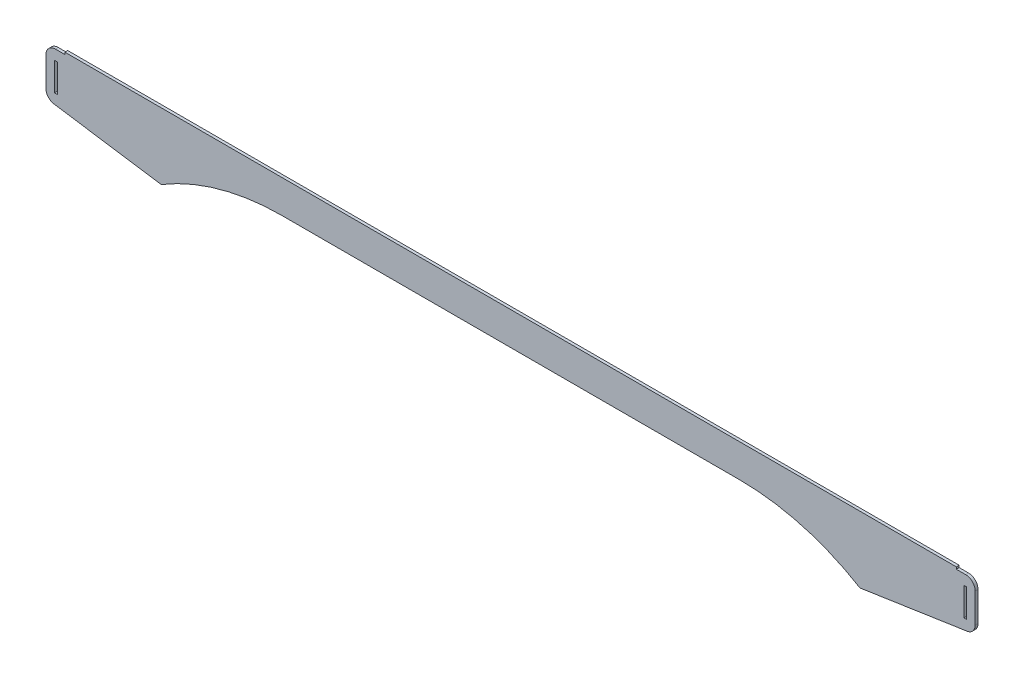
ISO-10303-21;
HEADER;
FILE_DESCRIPTION(('STEP AP214'),'2;1');
FILE_NAME('part.step','',(''),(''),'','','');
FILE_SCHEMA(('AUTOMOTIVE_DESIGN { 1 0 10303 214 1 1 1 1 }'));
ENDSEC;
DATA;
#1=APPLICATION_CONTEXT('core data for automotive mechanical design processes');
#2=APPLICATION_PROTOCOL_DEFINITION('international standard','automotive_design',2000,#1);
#3=PRODUCT_CONTEXT('',#1,'mechanical');
#4=PRODUCT('Part','Part','',(#3));
#5=PRODUCT_RELATED_PRODUCT_CATEGORY('part','',(#4));
#6=PRODUCT_DEFINITION_FORMATION('','',#4);
#7=PRODUCT_DEFINITION_CONTEXT('part definition',#1,'design');
#8=PRODUCT_DEFINITION('design','',#6,#7);
#9=PRODUCT_DEFINITION_SHAPE('','',#8);
#10=(LENGTH_UNIT() NAMED_UNIT(*) SI_UNIT(.MILLI.,.METRE.));
#11=(NAMED_UNIT(*) PLANE_ANGLE_UNIT() SI_UNIT($,.RADIAN.));
#12=(NAMED_UNIT(*) SI_UNIT($,.STERADIAN.) SOLID_ANGLE_UNIT());
#13=UNCERTAINTY_MEASURE_WITH_UNIT(LENGTH_MEASURE(1.E-05),#10,'distance_accuracy_value','');
#14=(GEOMETRIC_REPRESENTATION_CONTEXT(3) GLOBAL_UNCERTAINTY_ASSIGNED_CONTEXT((#13)) GLOBAL_UNIT_ASSIGNED_CONTEXT((#10,
#11,#12)) REPRESENTATION_CONTEXT('',''));
#15=CARTESIAN_POINT('',(0.,0.,0.));
#16=DIRECTION('',(0.,0.,1.));
#17=DIRECTION('',(1.,0.,0.));
#18=AXIS2_PLACEMENT_3D('',#15,#16,#17);
#19=CARTESIAN_POINT('',(463.458613344942,-126.458945824922,1.5));
#20=DIRECTION('',(0.,0.,1.));
#21=DIRECTION('',(1.,0.,0.));
#22=AXIS2_PLACEMENT_3D('',#19,#20,#21);
#23=PLANE('',#22);
#24=DIRECTION('',(0.,-1.,0.));
#25=VECTOR('',#24,1.);
#26=CARTESIAN_POINT('',(95.298887238053,13.9007753299311,1.5));
#27=LINE('',#26,#25);
#28=CARTESIAN_POINT('',(95.298887238053,8.90077532993114,1.5));
#29=VERTEX_POINT('',#28);
#30=CARTESIAN_POINT('',(95.298887238053,-6.79512655684654,1.5));
#31=VERTEX_POINT('',#30);
#32=EDGE_CURVE('E560',#29,#31,#27,.T.);
#33=ORIENTED_EDGE('',*,*,#32,.T.);
#34=CARTESIAN_POINT('',(100.298887238053,-6.79512655684654,1.5));
#35=DIRECTION('',(0.,0.,1.));
#36=DIRECTION('',(1.,0.,0.));
#37=AXIS2_PLACEMENT_3D('',#34,#35,#36);
#38=CIRCLE('',#37,5.);
#39=CARTESIAN_POINT('',(99.5550962363192,-11.7394945595077,1.5));
#40=VERTEX_POINT('',#39);
#41=EDGE_CURVE('E649',#31,#40,#38,.T.);
#42=ORIENTED_EDGE('',*,*,#41,.T.);
#43=DIRECTION('',(0.988873600532238,-0.148758200346767,0.));
#44=VECTOR('',#43,1.);
#45=CARTESIAN_POINT('',(95.298887238053,-11.0992246700689,1.5));
#46=LINE('',#45,#44);
#47=CARTESIAN_POINT('',(156.456101453399,-20.2992246700689,1.5));
#48=VERTEX_POINT('',#47);
#49=EDGE_CURVE('E563',#40,#48,#46,.T.);
#50=ORIENTED_EDGE('',*,*,#49,.T.);
#51=CARTESIAN_POINT('',(220.456101453399,-126.458945824922,1.5));
#52=DIRECTION('',(0.,0.,-1.));
#53=DIRECTION('',(-1.,0.,0.));
#54=AXIS2_PLACEMENT_3D('',#51,#52,#53);
#55=CIRCLE('',#54,123.9592126293);
#56=CARTESIAN_POINT('',(220.456101453399,-2.49973319562131,1.5));
#57=VERTEX_POINT('',#56);
#58=EDGE_CURVE('E565',#48,#57,#55,.T.);
#59=ORIENTED_EDGE('',*,*,#58,.T.);
#60=DIRECTION('',(1.,0.,0.));
#61=VECTOR('',#60,1.);
#62=CARTESIAN_POINT('',(463.458613344942,-2.49973319562131,1.5));
#63=LINE('',#62,#61);
#64=CARTESIAN_POINT('',(463.458613344942,-2.49973319562131,1.5));
#65=VERTEX_POINT('',#64);
#66=EDGE_CURVE('E567',#57,#65,#63,.T.);
#67=ORIENTED_EDGE('',*,*,#66,.T.);
#68=CARTESIAN_POINT('',(463.458613344942,-126.458945824922,1.5));
#69=DIRECTION('',(0.,0.,-1.));
#70=DIRECTION('',(1.,0.,0.));
#71=AXIS2_PLACEMENT_3D('',#68,#69,#70);
#72=CIRCLE('',#71,123.9592126293);
#73=CARTESIAN_POINT('',(527.458613344942,-20.2992246700689,1.5));
#74=VERTEX_POINT('',#73);
#75=EDGE_CURVE('E569',#65,#74,#72,.T.);
#76=ORIENTED_EDGE('',*,*,#75,.T.);
#77=DIRECTION('',(0.988873600532237,0.148758200346767,0.));
#78=VECTOR('',#77,1.);
#79=CARTESIAN_POINT('',(588.615827560288,-11.0992246700689,1.5));
#80=LINE('',#79,#78);
#81=CARTESIAN_POINT('',(584.359618562022,-11.7394945595077,1.5));
#82=VERTEX_POINT('',#81);
#83=EDGE_CURVE('E571',#74,#82,#80,.T.);
#84=ORIENTED_EDGE('',*,*,#83,.T.);
#85=CARTESIAN_POINT('',(583.615827560288,-6.79512655684654,1.5));
#86=DIRECTION('',(0.,0.,1.));
#87=DIRECTION('',(1.,0.,0.));
#88=AXIS2_PLACEMENT_3D('',#85,#86,#87);
#89=CIRCLE('',#88,5.);
#90=CARTESIAN_POINT('',(588.615827560288,-6.79512655684654,1.5));
#91=VERTEX_POINT('',#90);
#92=EDGE_CURVE('E645',#82,#91,#89,.T.);
#93=ORIENTED_EDGE('',*,*,#92,.T.);
#94=DIRECTION('',(0.,1.,0.));
#95=VECTOR('',#94,1.);
#96=CARTESIAN_POINT('',(588.615827560288,13.9007753299311,1.5));
#97=LINE('',#96,#95);
#98=CARTESIAN_POINT('',(588.615827560288,8.90077532993114,1.5));
#99=VERTEX_POINT('',#98);
#100=EDGE_CURVE('E574',#91,#99,#97,.T.);
#101=ORIENTED_EDGE('',*,*,#100,.T.);
#102=CARTESIAN_POINT('',(583.615827560288,8.90077532993114,1.5));
#103=DIRECTION('',(0.,0.,1.));
#104=DIRECTION('',(1.,0.,0.));
#105=AXIS2_PLACEMENT_3D('',#102,#103,#104);
#106=CIRCLE('',#105,5.);
#107=CARTESIAN_POINT('',(583.615827560288,13.9007753299311,1.5));
#108=VERTEX_POINT('',#107);
#109=EDGE_CURVE('E328',#99,#108,#106,.T.);
#110=ORIENTED_EDGE('',*,*,#109,.T.);
#111=DIRECTION('',(-1.,0.,0.));
#112=VECTOR('',#111,1.);
#113=CARTESIAN_POINT('',(578.615779673239,13.9007753299311,1.5));
#114=LINE('',#113,#112);
#115=CARTESIAN_POINT('',(578.615779673239,13.9007753299311,1.5));
#116=VERTEX_POINT('',#115);
#117=EDGE_CURVE('E576',#108,#116,#114,.T.);
#118=ORIENTED_EDGE('',*,*,#117,.T.);
#119=DIRECTION('',(0.,1.,0.));
#120=VECTOR('',#119,1.);
#121=CARTESIAN_POINT('',(578.615779673239,15.0002668043787,1.5));
#122=LINE('',#121,#120);
#123=CARTESIAN_POINT('',(578.615779673239,15.0002668043787,1.5));
#124=VERTEX_POINT('',#123);
#125=EDGE_CURVE('E549',#116,#124,#122,.T.);
#126=ORIENTED_EDGE('',*,*,#125,.T.);
#127=DIRECTION('',(-1.,0.,0.));
#128=VECTOR('',#127,1.);
#129=CARTESIAN_POINT('',(105.298935125102,15.0002668043787,1.5));
#130=LINE('',#129,#128);
#131=CARTESIAN_POINT('',(105.298935125102,15.0002668043787,1.5));
#132=VERTEX_POINT('',#131);
#133=EDGE_CURVE('E552',#124,#132,#130,.T.);
#134=ORIENTED_EDGE('',*,*,#133,.T.);
#135=DIRECTION('',(0.,-1.,0.));
#136=VECTOR('',#135,1.);
#137=CARTESIAN_POINT('',(105.298935125102,15.0002668043787,1.5));
#138=LINE('',#137,#136);
#139=CARTESIAN_POINT('',(105.298935125102,13.9007753299311,1.5));
#140=VERTEX_POINT('',#139);
#141=EDGE_CURVE('E555',#132,#140,#138,.T.);
#142=ORIENTED_EDGE('',*,*,#141,.T.);
#143=DIRECTION('',(-1.,0.,0.));
#144=VECTOR('',#143,1.);
#145=CARTESIAN_POINT('',(105.298935125102,13.9007753299311,1.5));
#146=LINE('',#145,#144);
#147=CARTESIAN_POINT('',(100.298887238053,13.9007753299311,1.5));
#148=VERTEX_POINT('',#147);
#149=EDGE_CURVE('E557',#140,#148,#146,.T.);
#150=ORIENTED_EDGE('',*,*,#149,.T.);
#151=CARTESIAN_POINT('',(100.298887238053,8.90077532993114,1.5));
#152=DIRECTION('',(0.,0.,1.));
#153=DIRECTION('',(1.,0.,0.));
#154=AXIS2_PLACEMENT_3D('',#151,#152,#153);
#155=CIRCLE('',#154,5.);
#156=EDGE_CURVE('E647',#148,#29,#155,.T.);
#157=ORIENTED_EDGE('',*,*,#156,.T.);
#158=EDGE_LOOP('',(#33,#42,#50,#59,#67,#76,#84,#93,#101,#110,#118,#126,#134,#142,#150,#157));
#159=FACE_BOUND('',#158,.T.);
#160=DIRECTION('',(1.,0.,0.));
#161=VECTOR('',#160,1.);
#162=CARTESIAN_POINT('',(582.615779673239,-6.49922467006889,1.5));
#163=LINE('',#162,#161);
#164=CARTESIAN_POINT('',(582.615779673239,-6.49922467006889,1.5));
#165=VERTEX_POINT('',#164);
#166=CARTESIAN_POINT('',(584.115827560288,-6.49922467006886,1.5));
#167=VERTEX_POINT('',#166);
#168=EDGE_CURVE('E520',#165,#167,#163,.T.);
#169=ORIENTED_EDGE('',*,*,#168,.F.);
#170=DIRECTION('',(0.,-1.,0.));
#171=VECTOR('',#170,1.);
#172=CARTESIAN_POINT('',(582.615779673239,8.50077532993114,1.5));
#173=LINE('',#172,#171);
#174=CARTESIAN_POINT('',(582.615779673239,8.50077532993114,1.5));
#175=VERTEX_POINT('',#174);
#176=EDGE_CURVE('E518',#175,#165,#173,.T.);
#177=ORIENTED_EDGE('',*,*,#176,.F.);
#178=DIRECTION('',(-1.,0.,0.));
#179=VECTOR('',#178,1.);
#180=CARTESIAN_POINT('',(582.615779673239,8.50077532993114,1.5));
#181=LINE('',#180,#179);
#182=CARTESIAN_POINT('',(584.115827560288,8.50077532993115,1.5));
#183=VERTEX_POINT('',#182);
#184=EDGE_CURVE('E526',#183,#175,#181,.T.);
#185=ORIENTED_EDGE('',*,*,#184,.F.);
#186=DIRECTION('',(0.,1.,0.));
#187=VECTOR('',#186,1.);
#188=CARTESIAN_POINT('',(584.115827560288,8.50077532993114,1.5));
#189=LINE('',#188,#187);
#190=EDGE_CURVE('E523',#167,#183,#189,.T.);
#191=ORIENTED_EDGE('',*,*,#190,.F.);
#192=EDGE_LOOP('',(#169,#177,#185,#191));
#193=FACE_BOUND('',#192,.T.);
#194=DIRECTION('',(0.,-1.,0.));
#195=VECTOR('',#194,1.);
#196=CARTESIAN_POINT('',(99.7988872380531,8.50077532993114,1.5));
#197=LINE('',#196,#195);
#198=CARTESIAN_POINT('',(99.7988872380531,8.50077532993114,1.5));
#199=VERTEX_POINT('',#198);
#200=CARTESIAN_POINT('',(99.7988872380531,-6.49922467006886,1.5));
#201=VERTEX_POINT('',#200);
#202=EDGE_CURVE('E487',#199,#201,#197,.T.);
#203=ORIENTED_EDGE('',*,*,#202,.F.);
#204=DIRECTION('',(-1.,0.,0.));
#205=VECTOR('',#204,1.);
#206=CARTESIAN_POINT('',(101.298935125102,8.50077532993114,1.5));
#207=LINE('',#206,#205);
#208=CARTESIAN_POINT('',(101.298935125102,8.50077532993114,1.5));
#209=VERTEX_POINT('',#208);
#210=EDGE_CURVE('E477',#209,#199,#207,.T.);
#211=ORIENTED_EDGE('',*,*,#210,.F.);
#212=DIRECTION('',(0.,1.,0.));
#213=VECTOR('',#212,1.);
#214=CARTESIAN_POINT('',(101.298935125102,8.50077532993114,1.5));
#215=LINE('',#214,#213);
#216=CARTESIAN_POINT('',(101.298935125102,-6.49922467006889,1.5));
#217=VERTEX_POINT('',#216);
#218=EDGE_CURVE('E502',#217,#209,#215,.T.);
#219=ORIENTED_EDGE('',*,*,#218,.F.);
#220=DIRECTION('',(1.,0.,0.));
#221=VECTOR('',#220,1.);
#222=CARTESIAN_POINT('',(101.298935125102,-6.49922467006889,1.5));
#223=LINE('',#222,#221);
#224=EDGE_CURVE('E500',#201,#217,#223,.T.);
#225=ORIENTED_EDGE('',*,*,#224,.F.);
#226=EDGE_LOOP('',(#203,#211,#219,#225));
#227=FACE_BOUND('',#226,.T.);
#228=ADVANCED_FACE('F313',(#159,#193,#227),#23,.T.);
#229=CARTESIAN_POINT('',(463.458613344942,-126.458945824922,0.));
#230=DIRECTION('',(0.,0.,1.));
#231=DIRECTION('',(1.,0.,0.));
#232=AXIS2_PLACEMENT_3D('',#229,#230,#231);
#233=PLANE('',#232);
#234=DIRECTION('',(0.,-1.,0.));
#235=VECTOR('',#234,1.);
#236=CARTESIAN_POINT('',(582.615779673239,8.50077532993114,0.));
#237=LINE('',#236,#235);
#238=CARTESIAN_POINT('',(582.615779673239,8.50077532993115,0.));
#239=VERTEX_POINT('',#238);
#240=CARTESIAN_POINT('',(582.615779673239,-6.49922467006889,0.));
#241=VERTEX_POINT('',#240);
#242=EDGE_CURVE('E495',#239,#241,#237,.T.);
#243=ORIENTED_EDGE('',*,*,#242,.T.);
#244=DIRECTION('',(1.,0.,0.));
#245=VECTOR('',#244,1.);
#246=CARTESIAN_POINT('',(582.615779673239,-6.49922467006889,0.));
#247=LINE('',#246,#245);
#248=CARTESIAN_POINT('',(584.115827560288,-6.49922467006886,0.));
#249=VERTEX_POINT('',#248);
#250=EDGE_CURVE('E531',#241,#249,#247,.T.);
#251=ORIENTED_EDGE('',*,*,#250,.T.);
#252=DIRECTION('',(0.,1.,0.));
#253=VECTOR('',#252,1.);
#254=CARTESIAN_POINT('',(584.115827560288,8.50077532993114,0.));
#255=LINE('',#254,#253);
#256=CARTESIAN_POINT('',(584.115827560288,8.50077532993114,0.));
#257=VERTEX_POINT('',#256);
#258=EDGE_CURVE('E534',#249,#257,#255,.T.);
#259=ORIENTED_EDGE('',*,*,#258,.T.);
#260=DIRECTION('',(-1.,0.,0.));
#261=VECTOR('',#260,1.);
#262=CARTESIAN_POINT('',(582.615779673239,8.50077532993114,0.));
#263=LINE('',#262,#261);
#264=EDGE_CURVE('E521',#257,#239,#263,.T.);
#265=ORIENTED_EDGE('',*,*,#264,.T.);
#266=EDGE_LOOP('',(#243,#251,#259,#265));
#267=FACE_BOUND('',#266,.T.);
#268=DIRECTION('',(0.988873600532238,-0.148758200346767,0.));
#269=VECTOR('',#268,1.);
#270=CARTESIAN_POINT('',(95.298887238053,-11.0992246700689,0.));
#271=LINE('',#270,#269);
#272=CARTESIAN_POINT('',(99.5550962363192,-11.7394945595077,0.));
#273=VERTEX_POINT('',#272);
#274=CARTESIAN_POINT('',(156.456101453399,-20.2992246700689,0.));
#275=VERTEX_POINT('',#274);
#276=EDGE_CURVE('E591',#273,#275,#271,.T.);
#277=ORIENTED_EDGE('',*,*,#276,.F.);
#278=CARTESIAN_POINT('',(100.298887238053,-6.79512655684654,0.));
#279=DIRECTION('',(0.,0.,1.));
#280=DIRECTION('',(1.,0.,0.));
#281=AXIS2_PLACEMENT_3D('',#278,#279,#280);
#282=CIRCLE('',#281,5.);
#283=CARTESIAN_POINT('',(95.298887238053,-6.79512655684654,0.));
#284=VERTEX_POINT('',#283);
#285=EDGE_CURVE('E637',#273,#284,#282,.F.);
#286=ORIENTED_EDGE('',*,*,#285,.T.);
#287=DIRECTION('',(0.,-1.,0.));
#288=VECTOR('',#287,1.);
#289=CARTESIAN_POINT('',(95.298887238053,13.9007753299311,0.));
#290=LINE('',#289,#288);
#291=CARTESIAN_POINT('',(95.298887238053,8.90077532993114,0.));
#292=VERTEX_POINT('',#291);
#293=EDGE_CURVE('E588',#292,#284,#290,.T.);
#294=ORIENTED_EDGE('',*,*,#293,.F.);
#295=CARTESIAN_POINT('',(100.298887238053,8.90077532993114,0.));
#296=DIRECTION('',(0.,0.,1.));
#297=DIRECTION('',(1.,0.,0.));
#298=AXIS2_PLACEMENT_3D('',#295,#296,#297);
#299=CIRCLE('',#298,5.);
#300=CARTESIAN_POINT('',(100.298887238053,13.9007753299311,0.));
#301=VERTEX_POINT('',#300);
#302=EDGE_CURVE('E635',#292,#301,#299,.F.);
#303=ORIENTED_EDGE('',*,*,#302,.T.);
#304=DIRECTION('',(-1.,0.,0.));
#305=VECTOR('',#304,1.);
#306=CARTESIAN_POINT('',(105.298935125102,13.9007753299311,0.));
#307=LINE('',#306,#305);
#308=CARTESIAN_POINT('',(105.298935125102,13.9007753299311,0.));
#309=VERTEX_POINT('',#308);
#310=EDGE_CURVE('E585',#309,#301,#307,.T.);
#311=ORIENTED_EDGE('',*,*,#310,.F.);
#312=DIRECTION('',(0.,-1.,0.));
#313=VECTOR('',#312,1.);
#314=CARTESIAN_POINT('',(105.298935125102,15.0002668043787,0.));
#315=LINE('',#314,#313);
#316=CARTESIAN_POINT('',(105.298935125102,15.0002668043787,0.));
#317=VERTEX_POINT('',#316);
#318=EDGE_CURVE('E583',#317,#309,#315,.T.);
#319=ORIENTED_EDGE('',*,*,#318,.F.);
#320=DIRECTION('',(-1.,0.,0.));
#321=VECTOR('',#320,1.);
#322=CARTESIAN_POINT('',(105.298935125102,15.0002668043787,0.));
#323=LINE('',#322,#321);
#324=CARTESIAN_POINT('',(578.615779673239,15.0002668043787,0.));
#325=VERTEX_POINT('',#324);
#326=EDGE_CURVE('E581',#325,#317,#323,.T.);
#327=ORIENTED_EDGE('',*,*,#326,.F.);
#328=DIRECTION('',(0.,1.,0.));
#329=VECTOR('',#328,1.);
#330=CARTESIAN_POINT('',(578.615779673239,15.0002668043787,0.));
#331=LINE('',#330,#329);
#332=CARTESIAN_POINT('',(578.615779673239,13.9007753299311,0.));
#333=VERTEX_POINT('',#332);
#334=EDGE_CURVE('E548',#333,#325,#331,.T.);
#335=ORIENTED_EDGE('',*,*,#334,.F.);
#336=DIRECTION('',(-1.,0.,0.));
#337=VECTOR('',#336,1.);
#338=CARTESIAN_POINT('',(578.615779673239,13.9007753299311,0.));
#339=LINE('',#338,#337);
#340=CARTESIAN_POINT('',(583.615827560288,13.9007753299311,0.));
#341=VERTEX_POINT('',#340);
#342=EDGE_CURVE('E553',#341,#333,#339,.T.);
#343=ORIENTED_EDGE('',*,*,#342,.F.);
#344=CARTESIAN_POINT('',(583.615827560288,8.90077532993114,0.));
#345=DIRECTION('',(0.,0.,1.));
#346=DIRECTION('',(1.,0.,0.));
#347=AXIS2_PLACEMENT_3D('',#344,#345,#346);
#348=CIRCLE('',#347,5.);
#349=CARTESIAN_POINT('',(588.615827560288,8.90077532993114,0.));
#350=VERTEX_POINT('',#349);
#351=EDGE_CURVE('E631',#341,#350,#348,.F.);
#352=ORIENTED_EDGE('',*,*,#351,.T.);
#353=DIRECTION('',(0.,1.,0.));
#354=VECTOR('',#353,1.);
#355=CARTESIAN_POINT('',(588.615827560288,13.9007753299311,0.));
#356=LINE('',#355,#354);
#357=CARTESIAN_POINT('',(588.615827560288,-6.79512655684654,0.));
#358=VERTEX_POINT('',#357);
#359=EDGE_CURVE('E602',#358,#350,#356,.T.);
#360=ORIENTED_EDGE('',*,*,#359,.F.);
#361=CARTESIAN_POINT('',(583.615827560288,-6.79512655684654,0.));
#362=DIRECTION('',(0.,0.,1.));
#363=DIRECTION('',(1.,0.,0.));
#364=AXIS2_PLACEMENT_3D('',#361,#362,#363);
#365=CIRCLE('',#364,5.);
#366=CARTESIAN_POINT('',(584.359618562022,-11.7394945595077,0.));
#367=VERTEX_POINT('',#366);
#368=EDGE_CURVE('E633',#358,#367,#365,.F.);
#369=ORIENTED_EDGE('',*,*,#368,.T.);
#370=DIRECTION('',(0.988873600532237,0.148758200346767,0.));
#371=VECTOR('',#370,1.);
#372=CARTESIAN_POINT('',(588.615827560288,-11.0992246700689,0.));
#373=LINE('',#372,#371);
#374=CARTESIAN_POINT('',(527.458613344942,-20.2992246700689,0.));
#375=VERTEX_POINT('',#374);
#376=EDGE_CURVE('E599',#375,#367,#373,.T.);
#377=ORIENTED_EDGE('',*,*,#376,.F.);
#378=CARTESIAN_POINT('',(463.458613344942,-126.458945824922,0.));
#379=DIRECTION('',(0.,0.,-1.));
#380=DIRECTION('',(1.,0.,0.));
#381=AXIS2_PLACEMENT_3D('',#378,#379,#380);
#382=CIRCLE('',#381,123.9592126293);
#383=CARTESIAN_POINT('',(463.458613344942,-2.49973319562131,0.));
#384=VERTEX_POINT('',#383);
#385=EDGE_CURVE('E597',#384,#375,#382,.T.);
#386=ORIENTED_EDGE('',*,*,#385,.F.);
#387=DIRECTION('',(1.,0.,0.));
#388=VECTOR('',#387,1.);
#389=CARTESIAN_POINT('',(463.458613344942,-2.49973319562131,0.));
#390=LINE('',#389,#388);
#391=CARTESIAN_POINT('',(220.456101453399,-2.49973319562131,0.));
#392=VERTEX_POINT('',#391);
#393=EDGE_CURVE('E595',#392,#384,#390,.T.);
#394=ORIENTED_EDGE('',*,*,#393,.F.);
#395=CARTESIAN_POINT('',(220.456101453399,-126.458945824922,0.));
#396=DIRECTION('',(0.,0.,-1.));
#397=DIRECTION('',(-1.,0.,0.));
#398=AXIS2_PLACEMENT_3D('',#395,#396,#397);
#399=CIRCLE('',#398,123.9592126293);
#400=EDGE_CURVE('E593',#275,#392,#399,.T.);
#401=ORIENTED_EDGE('',*,*,#400,.F.);
#402=EDGE_LOOP('',(#277,#286,#294,#303,#311,#319,#327,#335,#343,#352,#360,#369,#377,#386,#394,#401));
#403=FACE_BOUND('',#402,.T.);
#404=DIRECTION('',(-1.,0.,0.));
#405=VECTOR('',#404,1.);
#406=CARTESIAN_POINT('',(101.298935125102,8.50077532993114,0.));
#407=LINE('',#406,#405);
#408=CARTESIAN_POINT('',(101.298935125102,8.50077532993113,0.));
#409=VERTEX_POINT('',#408);
#410=CARTESIAN_POINT('',(99.7988872380531,8.50077532993114,0.));
#411=VERTEX_POINT('',#410);
#412=EDGE_CURVE('E506',#409,#411,#407,.T.);
#413=ORIENTED_EDGE('',*,*,#412,.T.);
#414=DIRECTION('',(0.,-1.,0.));
#415=VECTOR('',#414,1.);
#416=CARTESIAN_POINT('',(99.7988872380531,8.50077532993114,0.));
#417=LINE('',#416,#415);
#418=CARTESIAN_POINT('',(99.7988872380531,-6.49922467006886,0.));
#419=VERTEX_POINT('',#418);
#420=EDGE_CURVE('E494',#411,#419,#417,.T.);
#421=ORIENTED_EDGE('',*,*,#420,.T.);
#422=DIRECTION('',(1.,0.,0.));
#423=VECTOR('',#422,1.);
#424=CARTESIAN_POINT('',(101.298935125102,-6.49922467006889,0.));
#425=LINE('',#424,#423);
#426=CARTESIAN_POINT('',(101.298935125102,-6.49922467006889,0.));
#427=VERTEX_POINT('',#426);
#428=EDGE_CURVE('E509',#419,#427,#425,.T.);
#429=ORIENTED_EDGE('',*,*,#428,.T.);
#430=DIRECTION('',(0.,1.,0.));
#431=VECTOR('',#430,1.);
#432=CARTESIAN_POINT('',(101.298935125102,8.50077532993114,0.));
#433=LINE('',#432,#431);
#434=EDGE_CURVE('E488',#427,#409,#433,.T.);
#435=ORIENTED_EDGE('',*,*,#434,.T.);
#436=EDGE_LOOP('',(#413,#421,#429,#435));
#437=FACE_BOUND('',#436,.T.);
#438=ADVANCED_FACE('F672',(#267,#403,#437),#233,.F.);
#439=CARTESIAN_POINT('',(578.615779673239,15.0002668043787,1.5));
#440=DIRECTION('',(-1.,0.,0.));
#441=DIRECTION('',(0.,0.,1.));
#442=AXIS2_PLACEMENT_3D('',#439,#440,#441);
#443=PLANE('',#442);
#444=ORIENTED_EDGE('',*,*,#334,.T.);
#445=DIRECTION('',(0.,0.,-1.));
#446=VECTOR('',#445,1.);
#447=CARTESIAN_POINT('',(578.615779673239,15.0002668043787,1.5));
#448=LINE('',#447,#446);
#449=EDGE_CURVE('E625',#124,#325,#448,.T.);
#450=ORIENTED_EDGE('',*,*,#449,.F.);
#451=ORIENTED_EDGE('',*,*,#125,.F.);
#452=DIRECTION('',(0.,0.,-1.));
#453=VECTOR('',#452,1.);
#454=CARTESIAN_POINT('',(578.615779673239,13.9007753299311,1.5));
#455=LINE('',#454,#453);
#456=EDGE_CURVE('E578',#116,#333,#455,.T.);
#457=ORIENTED_EDGE('',*,*,#456,.T.);
#458=EDGE_LOOP('',(#444,#450,#451,#457));
#459=FACE_BOUND('',#458,.T.);
#460=ADVANCED_FACE('F685',(#459),#443,.F.);
#461=CARTESIAN_POINT('',(105.298935125102,15.0002668043787,1.5));
#462=DIRECTION('',(0.,-1.,0.));
#463=DIRECTION('',(0.,0.,-1.));
#464=AXIS2_PLACEMENT_3D('',#461,#462,#463);
#465=PLANE('',#464);
#466=ORIENTED_EDGE('',*,*,#326,.T.);
#467=DIRECTION('',(0.,0.,-1.));
#468=VECTOR('',#467,1.);
#469=CARTESIAN_POINT('',(105.298935125102,15.0002668043787,1.5));
#470=LINE('',#469,#468);
#471=EDGE_CURVE('E622',#132,#317,#470,.T.);
#472=ORIENTED_EDGE('',*,*,#471,.F.);
#473=ORIENTED_EDGE('',*,*,#133,.F.);
#474=ORIENTED_EDGE('',*,*,#449,.T.);
#475=EDGE_LOOP('',(#466,#472,#473,#474));
#476=FACE_BOUND('',#475,.T.);
#477=ADVANCED_FACE('F687',(#476),#465,.F.);
#478=CARTESIAN_POINT('',(105.298935125102,15.0002668043787,1.5));
#479=DIRECTION('',(1.,0.,0.));
#480=DIRECTION('',(0.,0.,-1.));
#481=AXIS2_PLACEMENT_3D('',#478,#479,#480);
#482=PLANE('',#481);
#483=ORIENTED_EDGE('',*,*,#318,.T.);
#484=DIRECTION('',(0.,0.,-1.));
#485=VECTOR('',#484,1.);
#486=CARTESIAN_POINT('',(105.298935125102,13.9007753299311,1.5));
#487=LINE('',#486,#485);
#488=EDGE_CURVE('E619',#140,#309,#487,.T.);
#489=ORIENTED_EDGE('',*,*,#488,.F.);
#490=ORIENTED_EDGE('',*,*,#141,.F.);
#491=ORIENTED_EDGE('',*,*,#471,.T.);
#492=EDGE_LOOP('',(#483,#489,#490,#491));
#493=FACE_BOUND('',#492,.T.);
#494=ADVANCED_FACE('F692',(#493),#482,.F.);
#495=CARTESIAN_POINT('',(105.298935125102,13.9007753299311,1.5));
#496=DIRECTION('',(0.,-1.,0.));
#497=DIRECTION('',(0.,0.,-1.));
#498=AXIS2_PLACEMENT_3D('',#495,#496,#497);
#499=PLANE('',#498);
#500=ORIENTED_EDGE('',*,*,#310,.T.);
#501=DIRECTION('',(0.,0.,-1.));
#502=VECTOR('',#501,1.);
#503=CARTESIAN_POINT('',(100.298887238053,13.9007753299311,1.5));
#504=LINE('',#503,#502);
#505=EDGE_CURVE('E651',#301,#148,#504,.F.);
#506=ORIENTED_EDGE('',*,*,#505,.T.);
#507=ORIENTED_EDGE('',*,*,#149,.F.);
#508=ORIENTED_EDGE('',*,*,#488,.T.);
#509=EDGE_LOOP('',(#500,#506,#507,#508));
#510=FACE_BOUND('',#509,.T.);
#511=ADVANCED_FACE('F900',(#510),#499,.F.);
#512=CARTESIAN_POINT('',(95.298887238053,13.9007753299311,1.5));
#513=DIRECTION('',(1.,0.,0.));
#514=DIRECTION('',(0.,0.,-1.));
#515=AXIS2_PLACEMENT_3D('',#512,#513,#514);
#516=PLANE('',#515);
#517=ORIENTED_EDGE('',*,*,#293,.T.);
#518=DIRECTION('',(0.,0.,-1.));
#519=VECTOR('',#518,1.);
#520=CARTESIAN_POINT('',(95.298887238053,-6.79512655684654,1.5));
#521=LINE('',#520,#519);
#522=EDGE_CURVE('E642',#284,#31,#521,.F.);
#523=ORIENTED_EDGE('',*,*,#522,.T.);
#524=ORIENTED_EDGE('',*,*,#32,.F.);
#525=DIRECTION('',(0.,0.,-1.));
#526=VECTOR('',#525,1.);
#527=CARTESIAN_POINT('',(95.298887238053,8.90077532993114,1.5));
#528=LINE('',#527,#526);
#529=EDGE_CURVE('E639',#29,#292,#528,.T.);
#530=ORIENTED_EDGE('',*,*,#529,.T.);
#531=EDGE_LOOP('',(#517,#523,#524,#530));
#532=FACE_BOUND('',#531,.T.);
#533=ADVANCED_FACE('F703',(#532),#516,.F.);
#534=CARTESIAN_POINT('',(95.298887238053,-11.0992246700689,1.5));
#535=DIRECTION('',(0.148758200346767,0.988873600532237,0.));
#536=DIRECTION('',(-0.988873600532238,0.148758200346767,0.));
#537=AXIS2_PLACEMENT_3D('',#534,#535,#536);
#538=PLANE('',#537);
#539=ORIENTED_EDGE('',*,*,#49,.F.);
#540=DIRECTION('',(0.,0.,-1.));
#541=VECTOR('',#540,1.);
#542=CARTESIAN_POINT('',(99.5550962363192,-11.7394945595077,1.5));
#543=LINE('',#542,#541);
#544=EDGE_CURVE('E628',#40,#273,#543,.T.);
#545=ORIENTED_EDGE('',*,*,#544,.T.);
#546=ORIENTED_EDGE('',*,*,#276,.T.);
#547=DIRECTION('',(0.,0.,-1.));
#548=VECTOR('',#547,1.);
#549=CARTESIAN_POINT('',(156.456101453399,-20.2992246700689,1.5));
#550=LINE('',#549,#548);
#551=EDGE_CURVE('E616',#48,#275,#550,.T.);
#552=ORIENTED_EDGE('',*,*,#551,.F.);
#553=EDGE_LOOP('',(#539,#545,#546,#552));
#554=FACE_BOUND('',#553,.T.);
#555=ADVANCED_FACE('F713',(#554),#538,.F.);
#556=CARTESIAN_POINT('',(220.456101453399,-126.458945824922,1.5));
#557=DIRECTION('',(0.,0.,-1.));
#558=DIRECTION('',(-1.,0.,0.));
#559=AXIS2_PLACEMENT_3D('',#556,#557,#558);
#560=CYLINDRICAL_SURFACE('',#559,123.9592126293);
#561=ORIENTED_EDGE('',*,*,#400,.T.);
#562=DIRECTION('',(0.,0.,-1.));
#563=VECTOR('',#562,1.);
#564=CARTESIAN_POINT('',(220.456101453399,-2.49973319562131,1.5));
#565=LINE('',#564,#563);
#566=EDGE_CURVE('E613',#57,#392,#565,.T.);
#567=ORIENTED_EDGE('',*,*,#566,.F.);
#568=ORIENTED_EDGE('',*,*,#58,.F.);
#569=ORIENTED_EDGE('',*,*,#551,.T.);
#570=EDGE_LOOP('',(#561,#567,#568,#569));
#571=FACE_BOUND('',#570,.T.);
#572=ADVANCED_FACE('F720',(#571),#560,.F.);
#573=CARTESIAN_POINT('',(463.458613344942,-2.49973319562131,1.5));
#574=DIRECTION('',(0.,1.,0.));
#575=DIRECTION('',(0.,0.,1.));
#576=AXIS2_PLACEMENT_3D('',#573,#574,#575);
#577=PLANE('',#576);
#578=ORIENTED_EDGE('',*,*,#393,.T.);
#579=DIRECTION('',(0.,0.,-1.));
#580=VECTOR('',#579,1.);
#581=CARTESIAN_POINT('',(463.458613344942,-2.49973319562131,1.5));
#582=LINE('',#581,#580);
#583=EDGE_CURVE('E610',#65,#384,#582,.T.);
#584=ORIENTED_EDGE('',*,*,#583,.F.);
#585=ORIENTED_EDGE('',*,*,#66,.F.);
#586=ORIENTED_EDGE('',*,*,#566,.T.);
#587=EDGE_LOOP('',(#578,#584,#585,#586));
#588=FACE_BOUND('',#587,.T.);
#589=ADVANCED_FACE('F723',(#588),#577,.F.);
#590=CARTESIAN_POINT('',(463.458613344942,-126.458945824922,1.5));
#591=DIRECTION('',(0.,0.,-1.));
#592=DIRECTION('',(-1.,0.,0.));
#593=AXIS2_PLACEMENT_3D('',#590,#591,#592);
#594=CYLINDRICAL_SURFACE('',#593,123.9592126293);
#595=ORIENTED_EDGE('',*,*,#385,.T.);
#596=DIRECTION('',(0.,0.,-1.));
#597=VECTOR('',#596,1.);
#598=CARTESIAN_POINT('',(527.458613344942,-20.2992246700689,1.5));
#599=LINE('',#598,#597);
#600=EDGE_CURVE('E607',#74,#375,#599,.T.);
#601=ORIENTED_EDGE('',*,*,#600,.F.);
#602=ORIENTED_EDGE('',*,*,#75,.F.);
#603=ORIENTED_EDGE('',*,*,#583,.T.);
#604=EDGE_LOOP('',(#595,#601,#602,#603));
#605=FACE_BOUND('',#604,.T.);
#606=ADVANCED_FACE('F726',(#605),#594,.F.);
#607=CARTESIAN_POINT('',(588.615827560288,-11.0992246700689,1.5));
#608=DIRECTION('',(-0.148758200346767,0.988873600532237,0.));
#609=DIRECTION('',(-0.988873600532237,-0.148758200346767,0.));
#610=AXIS2_PLACEMENT_3D('',#607,#608,#609);
#611=PLANE('',#610);
#612=ORIENTED_EDGE('',*,*,#376,.T.);
#613=DIRECTION('',(0.,0.,-1.));
#614=VECTOR('',#613,1.);
#615=CARTESIAN_POINT('',(584.359618562022,-11.7394945595077,1.5));
#616=LINE('',#615,#614);
#617=EDGE_CURVE('E321',#367,#82,#616,.F.);
#618=ORIENTED_EDGE('',*,*,#617,.T.);
#619=ORIENTED_EDGE('',*,*,#83,.F.);
#620=ORIENTED_EDGE('',*,*,#600,.T.);
#621=EDGE_LOOP('',(#612,#618,#619,#620));
#622=FACE_BOUND('',#621,.T.);
#623=ADVANCED_FACE('F659',(#622),#611,.F.);
#624=CARTESIAN_POINT('',(588.615827560288,13.9007753299311,1.5));
#625=DIRECTION('',(-1.,0.,0.));
#626=DIRECTION('',(0.,0.,1.));
#627=AXIS2_PLACEMENT_3D('',#624,#625,#626);
#628=PLANE('',#627);
#629=ORIENTED_EDGE('',*,*,#100,.F.);
#630=DIRECTION('',(0.,0.,-1.));
#631=VECTOR('',#630,1.);
#632=CARTESIAN_POINT('',(588.615827560288,-6.79512655684654,1.5));
#633=LINE('',#632,#631);
#634=EDGE_CURVE('E654',#91,#358,#633,.T.);
#635=ORIENTED_EDGE('',*,*,#634,.T.);
#636=ORIENTED_EDGE('',*,*,#359,.T.);
#637=DIRECTION('',(0.,0.,-1.));
#638=VECTOR('',#637,1.);
#639=CARTESIAN_POINT('',(588.615827560288,8.90077532993114,1.5));
#640=LINE('',#639,#638);
#641=EDGE_CURVE('E336',#350,#99,#640,.F.);
#642=ORIENTED_EDGE('',*,*,#641,.T.);
#643=EDGE_LOOP('',(#629,#635,#636,#642));
#644=FACE_BOUND('',#643,.T.);
#645=ADVANCED_FACE('F669',(#644),#628,.F.);
#646=CARTESIAN_POINT('',(578.615779673239,13.9007753299311,1.5));
#647=DIRECTION('',(0.,-1.,0.));
#648=DIRECTION('',(0.,0.,-1.));
#649=AXIS2_PLACEMENT_3D('',#646,#647,#648);
#650=PLANE('',#649);
#651=ORIENTED_EDGE('',*,*,#117,.F.);
#652=DIRECTION('',(0.,0.,-1.));
#653=VECTOR('',#652,1.);
#654=CARTESIAN_POINT('',(583.615827560288,13.9007753299311,1.5));
#655=LINE('',#654,#653);
#656=EDGE_CURVE('E14',#108,#341,#655,.T.);
#657=ORIENTED_EDGE('',*,*,#656,.T.);
#658=ORIENTED_EDGE('',*,*,#342,.T.);
#659=ORIENTED_EDGE('',*,*,#456,.F.);
#660=EDGE_LOOP('',(#651,#657,#658,#659));
#661=FACE_BOUND('',#660,.T.);
#662=ADVANCED_FACE('F679',(#661),#650,.F.);
#663=CARTESIAN_POINT('',(582.615779673239,8.50077532993114,1.5));
#664=DIRECTION('',(1.,0.,0.));
#665=DIRECTION('',(0.,0.,-1.));
#666=AXIS2_PLACEMENT_3D('',#663,#664,#665);
#667=PLANE('',#666);
#668=ORIENTED_EDGE('',*,*,#242,.F.);
#669=DIRECTION('',(0.,0.,-1.));
#670=VECTOR('',#669,1.);
#671=CARTESIAN_POINT('',(582.615779673239,8.50077532993114,1.5));
#672=LINE('',#671,#670);
#673=EDGE_CURVE('E528',#175,#239,#672,.T.);
#674=ORIENTED_EDGE('',*,*,#673,.F.);
#675=ORIENTED_EDGE('',*,*,#176,.T.);
#676=DIRECTION('',(0.,0.,-1.));
#677=VECTOR('',#676,1.);
#678=CARTESIAN_POINT('',(582.615779673239,-6.49922467006889,1.5));
#679=LINE('',#678,#677);
#680=EDGE_CURVE('E545',#165,#241,#679,.T.);
#681=ORIENTED_EDGE('',*,*,#680,.T.);
#682=EDGE_LOOP('',(#668,#674,#675,#681));
#683=FACE_BOUND('',#682,.T.);
#684=ADVANCED_FACE('F743',(#683),#667,.T.);
#685=CARTESIAN_POINT('',(582.615779673239,-6.49922467006889,1.5));
#686=DIRECTION('',(0.,1.,0.));
#687=DIRECTION('',(-1.,0.,0.));
#688=AXIS2_PLACEMENT_3D('',#685,#686,#687);
#689=PLANE('',#688);
#690=ORIENTED_EDGE('',*,*,#250,.F.);
#691=ORIENTED_EDGE('',*,*,#680,.F.);
#692=ORIENTED_EDGE('',*,*,#168,.T.);
#693=DIRECTION('',(0.,0.,-1.));
#694=VECTOR('',#693,1.);
#695=CARTESIAN_POINT('',(584.115827560288,-6.49922467006886,1.5));
#696=LINE('',#695,#694);
#697=EDGE_CURVE('E543',#167,#249,#696,.T.);
#698=ORIENTED_EDGE('',*,*,#697,.T.);
#699=EDGE_LOOP('',(#690,#691,#692,#698));
#700=FACE_BOUND('',#699,.T.);
#701=ADVANCED_FACE('F764',(#700),#689,.T.);
#702=CARTESIAN_POINT('',(584.115827560288,8.50077532993114,1.5));
#703=DIRECTION('',(-1.,0.,0.));
#704=DIRECTION('',(0.,0.,1.));
#705=AXIS2_PLACEMENT_3D('',#702,#703,#704);
#706=PLANE('',#705);
#707=ORIENTED_EDGE('',*,*,#258,.F.);
#708=ORIENTED_EDGE('',*,*,#697,.F.);
#709=ORIENTED_EDGE('',*,*,#190,.T.);
#710=DIRECTION('',(0.,0.,-1.));
#711=VECTOR('',#710,1.);
#712=CARTESIAN_POINT('',(584.115827560288,8.50077532993114,1.5));
#713=LINE('',#712,#711);
#714=EDGE_CURVE('E541',#183,#257,#713,.T.);
#715=ORIENTED_EDGE('',*,*,#714,.T.);
#716=EDGE_LOOP('',(#707,#708,#709,#715));
#717=FACE_BOUND('',#716,.T.);
#718=ADVANCED_FACE('F771',(#717),#706,.T.);
#719=CARTESIAN_POINT('',(582.615779673239,8.50077532993114,1.5));
#720=DIRECTION('',(0.,-1.,0.));
#721=DIRECTION('',(0.,0.,-1.));
#722=AXIS2_PLACEMENT_3D('',#719,#720,#721);
#723=PLANE('',#722);
#724=ORIENTED_EDGE('',*,*,#264,.F.);
#725=ORIENTED_EDGE('',*,*,#714,.F.);
#726=ORIENTED_EDGE('',*,*,#184,.T.);
#727=ORIENTED_EDGE('',*,*,#673,.T.);
#728=EDGE_LOOP('',(#724,#725,#726,#727));
#729=FACE_BOUND('',#728,.T.);
#730=ADVANCED_FACE('F778',(#729),#723,.T.);
#731=CARTESIAN_POINT('',(101.298935125102,8.50077532993114,1.5));
#732=DIRECTION('',(0.,-1.,0.));
#733=DIRECTION('',(0.,0.,-1.));
#734=AXIS2_PLACEMENT_3D('',#731,#732,#733);
#735=PLANE('',#734);
#736=ORIENTED_EDGE('',*,*,#412,.F.);
#737=DIRECTION('',(0.,0.,-1.));
#738=VECTOR('',#737,1.);
#739=CARTESIAN_POINT('',(101.298935125102,8.50077532993114,1.5));
#740=LINE('',#739,#738);
#741=EDGE_CURVE('E483',#209,#409,#740,.T.);
#742=ORIENTED_EDGE('',*,*,#741,.F.);
#743=ORIENTED_EDGE('',*,*,#210,.T.);
#744=DIRECTION('',(0.,0.,-1.));
#745=VECTOR('',#744,1.);
#746=CARTESIAN_POINT('',(99.7988872380531,8.50077532993114,1.5));
#747=LINE('',#746,#745);
#748=EDGE_CURVE('E480',#199,#411,#747,.T.);
#749=ORIENTED_EDGE('',*,*,#748,.T.);
#750=EDGE_LOOP('',(#736,#742,#743,#749));
#751=FACE_BOUND('',#750,.T.);
#752=ADVANCED_FACE('F479',(#751),#735,.T.);
#753=CARTESIAN_POINT('',(99.7988872380531,8.50077532993114,1.5));
#754=DIRECTION('',(1.,0.,0.));
#755=DIRECTION('',(0.,0.,-1.));
#756=AXIS2_PLACEMENT_3D('',#753,#754,#755);
#757=PLANE('',#756);
#758=ORIENTED_EDGE('',*,*,#420,.F.);
#759=ORIENTED_EDGE('',*,*,#748,.F.);
#760=ORIENTED_EDGE('',*,*,#202,.T.);
#761=DIRECTION('',(0.,0.,-1.));
#762=VECTOR('',#761,1.);
#763=CARTESIAN_POINT('',(99.7988872380531,-6.49922467006886,1.5));
#764=LINE('',#763,#762);
#765=EDGE_CURVE('E496',#201,#419,#764,.T.);
#766=ORIENTED_EDGE('',*,*,#765,.T.);
#767=EDGE_LOOP('',(#758,#759,#760,#766));
#768=FACE_BOUND('',#767,.T.);
#769=ADVANCED_FACE('F491',(#768),#757,.T.);
#770=CARTESIAN_POINT('',(101.298935125102,-6.49922467006889,1.5));
#771=DIRECTION('',(0.,1.,0.));
#772=DIRECTION('',(-1.,0.,0.));
#773=AXIS2_PLACEMENT_3D('',#770,#771,#772);
#774=PLANE('',#773);
#775=ORIENTED_EDGE('',*,*,#428,.F.);
#776=ORIENTED_EDGE('',*,*,#765,.F.);
#777=ORIENTED_EDGE('',*,*,#224,.T.);
#778=DIRECTION('',(0.,0.,-1.));
#779=VECTOR('',#778,1.);
#780=CARTESIAN_POINT('',(101.298935125102,-6.49922467006889,1.5));
#781=LINE('',#780,#779);
#782=EDGE_CURVE('E515',#217,#427,#781,.T.);
#783=ORIENTED_EDGE('',*,*,#782,.T.);
#784=EDGE_LOOP('',(#775,#776,#777,#783));
#785=FACE_BOUND('',#784,.T.);
#786=ADVANCED_FACE('F799',(#785),#774,.T.);
#787=CARTESIAN_POINT('',(101.298935125102,8.50077532993114,1.5));
#788=DIRECTION('',(-1.,0.,0.));
#789=DIRECTION('',(0.,0.,1.));
#790=AXIS2_PLACEMENT_3D('',#787,#788,#789);
#791=PLANE('',#790);
#792=ORIENTED_EDGE('',*,*,#434,.F.);
#793=ORIENTED_EDGE('',*,*,#782,.F.);
#794=ORIENTED_EDGE('',*,*,#218,.T.);
#795=ORIENTED_EDGE('',*,*,#741,.T.);
#796=EDGE_LOOP('',(#792,#793,#794,#795));
#797=FACE_BOUND('',#796,.T.);
#798=ADVANCED_FACE('F806',(#797),#791,.T.);
#799=CARTESIAN_POINT('',(100.298887238053,-6.79512655684654,1.5));
#800=DIRECTION('',(0.,0.,-1.));
#801=DIRECTION('',(-1.,0.,0.));
#802=AXIS2_PLACEMENT_3D('',#799,#800,#801);
#803=CYLINDRICAL_SURFACE('',#802,5.);
#804=ORIENTED_EDGE('',*,*,#41,.F.);
#805=ORIENTED_EDGE('',*,*,#522,.F.);
#806=ORIENTED_EDGE('',*,*,#285,.F.);
#807=ORIENTED_EDGE('',*,*,#544,.F.);
#808=EDGE_LOOP('',(#804,#805,#806,#807));
#809=FACE_BOUND('',#808,.T.);
#810=ADVANCED_FACE('F710',(#809),#803,.T.);
#811=CARTESIAN_POINT('',(100.298887238053,8.90077532993114,1.5));
#812=DIRECTION('',(0.,0.,-1.));
#813=DIRECTION('',(-1.,0.,0.));
#814=AXIS2_PLACEMENT_3D('',#811,#812,#813);
#815=CYLINDRICAL_SURFACE('',#814,5.);
#816=ORIENTED_EDGE('',*,*,#156,.F.);
#817=ORIENTED_EDGE('',*,*,#505,.F.);
#818=ORIENTED_EDGE('',*,*,#302,.F.);
#819=ORIENTED_EDGE('',*,*,#529,.F.);
#820=EDGE_LOOP('',(#816,#817,#818,#819));
#821=FACE_BOUND('',#820,.T.);
#822=ADVANCED_FACE('F700',(#821),#815,.T.);
#823=CARTESIAN_POINT('',(583.615827560288,-6.79512655684654,1.5));
#824=DIRECTION('',(0.,0.,-1.));
#825=DIRECTION('',(-1.,0.,0.));
#826=AXIS2_PLACEMENT_3D('',#823,#824,#825);
#827=CYLINDRICAL_SURFACE('',#826,5.);
#828=ORIENTED_EDGE('',*,*,#92,.F.);
#829=ORIENTED_EDGE('',*,*,#617,.F.);
#830=ORIENTED_EDGE('',*,*,#368,.F.);
#831=ORIENTED_EDGE('',*,*,#634,.F.);
#832=EDGE_LOOP('',(#828,#829,#830,#831));
#833=FACE_BOUND('',#832,.T.);
#834=ADVANCED_FACE('F667',(#833),#827,.T.);
#835=CARTESIAN_POINT('',(583.615827560288,8.90077532993114,1.5));
#836=DIRECTION('',(0.,0.,-1.));
#837=DIRECTION('',(-1.,0.,0.));
#838=AXIS2_PLACEMENT_3D('',#835,#836,#837);
#839=CYLINDRICAL_SURFACE('',#838,5.);
#840=ORIENTED_EDGE('',*,*,#109,.F.);
#841=ORIENTED_EDGE('',*,*,#641,.F.);
#842=ORIENTED_EDGE('',*,*,#351,.F.);
#843=ORIENTED_EDGE('',*,*,#656,.F.);
#844=EDGE_LOOP('',(#840,#841,#842,#843));
#845=FACE_BOUND('',#844,.T.);
#846=ADVANCED_FACE('F315',(#845),#839,.T.);
#847=CLOSED_SHELL('',(#228,#438,#460,#477,#494,#511,#533,#555,#572,#589,#606,#623,#645,#662,
#684,#701,#718,#730,#752,#769,#786,#798,#810,#822,#834,#846));
#848=MANIFOLD_SOLID_BREP('B2',#847);
#849=ADVANCED_BREP_SHAPE_REPRESENTATION('',(#18,#848),#14);
#850=SHAPE_DEFINITION_REPRESENTATION(#9,#849);
ENDSEC;
END-ISO-10303-21;
